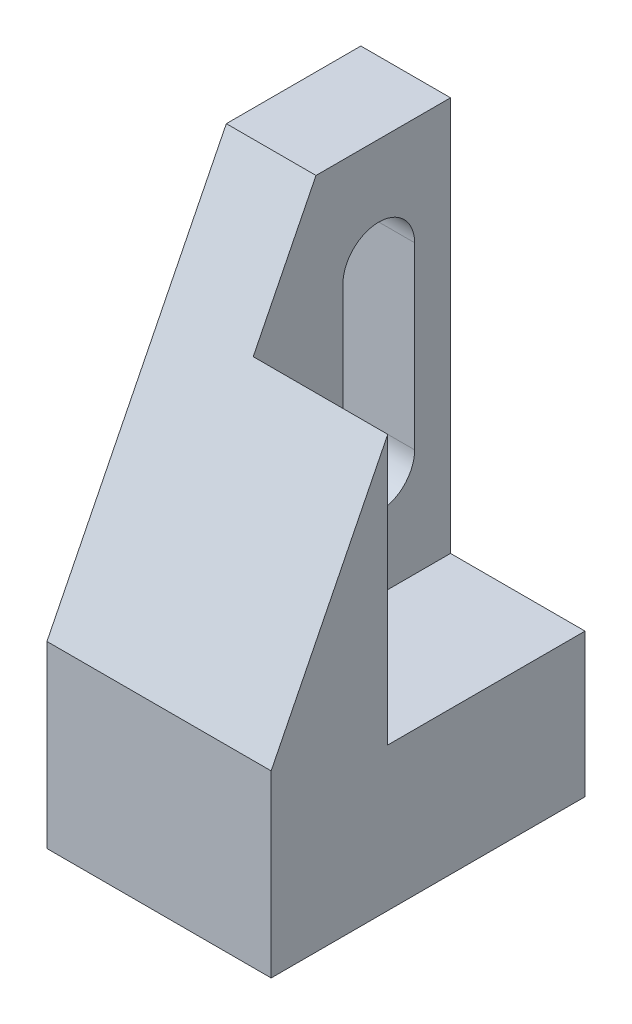
ISO-10303-21;
HEADER;
FILE_DESCRIPTION(('STEP AP214'),'2;1');
FILE_NAME('part.step','',(''),(''),'','','');
FILE_SCHEMA(('AUTOMOTIVE_DESIGN { 1 0 10303 214 1 1 1 1 }'));
ENDSEC;
DATA;
#1=APPLICATION_CONTEXT('core data for automotive mechanical design processes');
#2=APPLICATION_PROTOCOL_DEFINITION('international standard','automotive_design',2000,#1);
#3=PRODUCT_CONTEXT('',#1,'mechanical');
#4=PRODUCT('Part','Part','',(#3));
#5=PRODUCT_RELATED_PRODUCT_CATEGORY('part','',(#4));
#6=PRODUCT_DEFINITION_FORMATION('','',#4);
#7=PRODUCT_DEFINITION_CONTEXT('part definition',#1,'design');
#8=PRODUCT_DEFINITION('design','',#6,#7);
#9=PRODUCT_DEFINITION_SHAPE('','',#8);
#10=(LENGTH_UNIT() NAMED_UNIT(*) SI_UNIT(.MILLI.,.METRE.));
#11=(NAMED_UNIT(*) PLANE_ANGLE_UNIT() SI_UNIT($,.RADIAN.));
#12=(NAMED_UNIT(*) SI_UNIT($,.STERADIAN.) SOLID_ANGLE_UNIT());
#13=UNCERTAINTY_MEASURE_WITH_UNIT(LENGTH_MEASURE(1.E-05),#10,'distance_accuracy_value','');
#14=(GEOMETRIC_REPRESENTATION_CONTEXT(3) GLOBAL_UNCERTAINTY_ASSIGNED_CONTEXT((#13)) GLOBAL_UNIT_ASSIGNED_CONTEXT((#10,
#11,#12)) REPRESENTATION_CONTEXT('',''));
#15=CARTESIAN_POINT('',(0.,0.,0.));
#16=DIRECTION('',(0.,0.,1.));
#17=DIRECTION('',(1.,0.,0.));
#18=AXIS2_PLACEMENT_3D('',#15,#16,#17);
#19=CARTESIAN_POINT('',(25.,7.2,14.4));
#20=DIRECTION('',(0.,-0.447213595499958,-0.894427190999916));
#21=DIRECTION('',(0.,0.894427190999916,-0.447213595499958));
#22=AXIS2_PLACEMENT_3D('',#19,#20,#21);
#23=PLANE('',#22);
#24=DIRECTION('',(1.,0.,0.));
#25=VECTOR('',#24,1.);
#26=CARTESIAN_POINT('',(10.,8.,14.));
#27=LINE('',#26,#25);
#28=CARTESIAN_POINT('',(10.,8.,14.));
#29=VERTEX_POINT('',#28);
#30=CARTESIAN_POINT('',(25.,8.,14.));
#31=VERTEX_POINT('',#30);
#32=EDGE_CURVE('E234',#29,#31,#27,.T.);
#33=ORIENTED_EDGE('',*,*,#32,.F.);
#34=DIRECTION('',(0.,-0.894427190999916,0.447213595499958));
#35=VECTOR('',#34,1.);
#36=CARTESIAN_POINT('',(10.,7.2,14.4));
#37=LINE('',#36,#35);
#38=CARTESIAN_POINT('',(10.,22.,7.));
#39=VERTEX_POINT('',#38);
#40=EDGE_CURVE('E237',#39,#29,#37,.T.);
#41=ORIENTED_EDGE('',*,*,#40,.F.);
#42=DIRECTION('',(-1.,0.,0.));
#43=VECTOR('',#42,1.);
#44=CARTESIAN_POINT('',(25.,22.,7.));
#45=LINE('',#44,#43);
#46=CARTESIAN_POINT('',(0.,22.,7.));
#47=VERTEX_POINT('',#46);
#48=EDGE_CURVE('E148',#39,#47,#45,.T.);
#49=ORIENTED_EDGE('',*,*,#48,.T.);
#50=DIRECTION('',(0.,-0.894427190999916,0.447213595499958));
#51=VECTOR('',#50,1.);
#52=CARTESIAN_POINT('',(0.,7.2,14.4));
#53=LINE('',#52,#51);
#54=CARTESIAN_POINT('',(0.,-18.,27.));
#55=VERTEX_POINT('',#54);
#56=EDGE_CURVE('E167',#47,#55,#53,.T.);
#57=ORIENTED_EDGE('',*,*,#56,.T.);
#58=DIRECTION('',(-1.,0.,0.));
#59=VECTOR('',#58,1.);
#60=CARTESIAN_POINT('',(25.,-18.,27.));
#61=LINE('',#60,#59);
#62=CARTESIAN_POINT('',(25.,-18.,27.));
#63=VERTEX_POINT('',#62);
#64=EDGE_CURVE('E11',#63,#55,#61,.T.);
#65=ORIENTED_EDGE('',*,*,#64,.F.);
#66=DIRECTION('',(0.,-0.894427190999916,0.447213595499958));
#67=VECTOR('',#66,1.);
#68=CARTESIAN_POINT('',(25.,7.2,14.4));
#69=LINE('',#68,#67);
#70=EDGE_CURVE('E156',#31,#63,#69,.T.);
#71=ORIENTED_EDGE('',*,*,#70,.F.);
#72=EDGE_LOOP('',(#33,#41,#49,#57,#65,#71));
#73=FACE_BOUND('',#72,.T.);
#74=ADVANCED_FACE('F39',(#73),#23,.F.);
#75=CARTESIAN_POINT('',(25.,0.,-8.));
#76=DIRECTION('',(0.,0.,1.));
#77=DIRECTION('',(1.,0.,0.));
#78=AXIS2_PLACEMENT_3D('',#75,#76,#77);
#79=PLANE('',#78);
#80=DIRECTION('',(1.,0.,0.));
#81=VECTOR('',#80,1.);
#82=CARTESIAN_POINT('',(10.,-22.,-8.));
#83=LINE('',#82,#81);
#84=CARTESIAN_POINT('',(10.,-22.,-8.));
#85=VERTEX_POINT('',#84);
#86=CARTESIAN_POINT('',(25.,-22.,-8.));
#87=VERTEX_POINT('',#86);
#88=EDGE_CURVE('E199',#85,#87,#83,.T.);
#89=ORIENTED_EDGE('',*,*,#88,.T.);
#90=DIRECTION('',(0.,1.,0.));
#91=VECTOR('',#90,1.);
#92=CARTESIAN_POINT('',(25.,0.,-8.));
#93=LINE('',#92,#91);
#94=CARTESIAN_POINT('',(25.,-38.,-8.));
#95=VERTEX_POINT('',#94);
#96=EDGE_CURVE('E163',#95,#87,#93,.T.);
#97=ORIENTED_EDGE('',*,*,#96,.F.);
#98=DIRECTION('',(-1.,0.,0.));
#99=VECTOR('',#98,1.);
#100=CARTESIAN_POINT('',(25.,-38.,-8.));
#101=LINE('',#100,#99);
#102=CARTESIAN_POINT('',(0.,-38.,-8.));
#103=VERTEX_POINT('',#102);
#104=EDGE_CURVE('E166',#95,#103,#101,.T.);
#105=ORIENTED_EDGE('',*,*,#104,.T.);
#106=DIRECTION('',(0.,1.,0.));
#107=VECTOR('',#106,1.);
#108=CARTESIAN_POINT('',(0.,0.,-8.));
#109=LINE('',#108,#107);
#110=CARTESIAN_POINT('',(0.,22.,-8.));
#111=VERTEX_POINT('',#110);
#112=EDGE_CURVE('E159',#103,#111,#109,.T.);
#113=ORIENTED_EDGE('',*,*,#112,.T.);
#114=DIRECTION('',(-1.,0.,0.));
#115=VECTOR('',#114,1.);
#116=CARTESIAN_POINT('',(25.,22.,-8.));
#117=LINE('',#116,#115);
#118=CARTESIAN_POINT('',(10.,22.,-8.));
#119=VERTEX_POINT('',#118);
#120=EDGE_CURVE('E150',#119,#111,#117,.T.);
#121=ORIENTED_EDGE('',*,*,#120,.F.);
#122=DIRECTION('',(0.,1.,0.));
#123=VECTOR('',#122,1.);
#124=CARTESIAN_POINT('',(10.,0.,-8.));
#125=LINE('',#124,#123);
#126=EDGE_CURVE('E53',#85,#119,#125,.T.);
#127=ORIENTED_EDGE('',*,*,#126,.F.);
#128=EDGE_LOOP('',(#89,#97,#105,#113,#121,#127));
#129=FACE_BOUND('',#128,.T.);
#130=ADVANCED_FACE('F197',(#129),#79,.F.);
#131=CARTESIAN_POINT('',(25.,0.,0.));
#132=DIRECTION('',(1.,0.,0.));
#133=DIRECTION('',(0.,0.,-1.));
#134=AXIS2_PLACEMENT_3D('',#131,#132,#133);
#135=PLANE('',#134);
#136=DIRECTION('',(0.,0.,1.));
#137=VECTOR('',#136,1.);
#138=CARTESIAN_POINT('',(25.,-22.,0.));
#139=LINE('',#138,#137);
#140=CARTESIAN_POINT('',(25.,-22.,14.));
#141=VERTEX_POINT('',#140);
#142=EDGE_CURVE('E134',#87,#141,#139,.T.);
#143=ORIENTED_EDGE('',*,*,#142,.T.);
#144=DIRECTION('',(0.,1.,0.));
#145=VECTOR('',#144,1.);
#146=CARTESIAN_POINT('',(25.,0.,14.));
#147=LINE('',#146,#145);
#148=EDGE_CURVE('E241',#141,#31,#147,.T.);
#149=ORIENTED_EDGE('',*,*,#148,.T.);
#150=ORIENTED_EDGE('',*,*,#70,.T.);
#151=DIRECTION('',(0.,-1.,0.));
#152=VECTOR('',#151,1.);
#153=CARTESIAN_POINT('',(25.,0.,27.));
#154=LINE('',#153,#152);
#155=CARTESIAN_POINT('',(25.,-38.,27.));
#156=VERTEX_POINT('',#155);
#157=EDGE_CURVE('E158',#63,#156,#154,.T.);
#158=ORIENTED_EDGE('',*,*,#157,.T.);
#159=DIRECTION('',(0.,0.,-1.));
#160=VECTOR('',#159,1.);
#161=CARTESIAN_POINT('',(25.,-38.,0.));
#162=LINE('',#161,#160);
#163=EDGE_CURVE('E161',#156,#95,#162,.T.);
#164=ORIENTED_EDGE('',*,*,#163,.T.);
#165=ORIENTED_EDGE('',*,*,#96,.T.);
#166=EDGE_LOOP('',(#143,#149,#150,#158,#164,#165));
#167=FACE_BOUND('',#166,.T.);
#168=ADVANCED_FACE('F202',(#167),#135,.T.);
#169=CARTESIAN_POINT('',(25.,22.,0.));
#170=DIRECTION('',(0.,-1.,0.));
#171=DIRECTION('',(0.,0.,-1.));
#172=AXIS2_PLACEMENT_3D('',#169,#170,#171);
#173=PLANE('',#172);
#174=DIRECTION('',(0.,0.,1.));
#175=VECTOR('',#174,1.);
#176=CARTESIAN_POINT('',(10.,22.,0.));
#177=LINE('',#176,#175);
#178=EDGE_CURVE('E245',#119,#39,#177,.T.);
#179=ORIENTED_EDGE('',*,*,#178,.F.);
#180=ORIENTED_EDGE('',*,*,#120,.T.);
#181=DIRECTION('',(0.,0.,1.));
#182=VECTOR('',#181,1.);
#183=CARTESIAN_POINT('',(0.,22.,0.));
#184=LINE('',#183,#182);
#185=EDGE_CURVE('E193',#111,#47,#184,.T.);
#186=ORIENTED_EDGE('',*,*,#185,.T.);
#187=ORIENTED_EDGE('',*,*,#48,.F.);
#188=EDGE_LOOP('',(#179,#180,#186,#187));
#189=FACE_BOUND('',#188,.T.);
#190=ADVANCED_FACE('F212',(#189),#173,.F.);
#191=CARTESIAN_POINT('',(25.,10.,0.));
#192=DIRECTION('',(-1.,0.,0.));
#193=DIRECTION('',(0.,0.,1.));
#194=AXIS2_PLACEMENT_3D('',#191,#192,#193);
#195=CYLINDRICAL_SURFACE('',#194,4.);
#196=DIRECTION('',(-1.,0.,0.));
#197=VECTOR('',#196,1.);
#198=CARTESIAN_POINT('',(25.,10.,-4.));
#199=LINE('',#198,#197);
#200=CARTESIAN_POINT('',(10.,10.,-4.));
#201=VERTEX_POINT('',#200);
#202=CARTESIAN_POINT('',(0.,10.,-4.));
#203=VERTEX_POINT('',#202);
#204=EDGE_CURVE('E140',#201,#203,#199,.T.);
#205=ORIENTED_EDGE('',*,*,#204,.F.);
#206=CARTESIAN_POINT('',(10.,10.,0.));
#207=DIRECTION('',(1.,0.,0.));
#208=DIRECTION('',(0.,0.,-1.));
#209=AXIS2_PLACEMENT_3D('',#206,#207,#208);
#210=CIRCLE('',#209,4.);
#211=CARTESIAN_POINT('',(10.,10.,4.));
#212=VERTEX_POINT('',#211);
#213=EDGE_CURVE('E126',#201,#212,#210,.T.);
#214=ORIENTED_EDGE('',*,*,#213,.T.);
#215=DIRECTION('',(-1.,0.,0.));
#216=VECTOR('',#215,1.);
#217=CARTESIAN_POINT('',(25.,10.,4.));
#218=LINE('',#217,#216);
#219=CARTESIAN_POINT('',(0.,10.,4.));
#220=VERTEX_POINT('',#219);
#221=EDGE_CURVE('E213',#212,#220,#218,.T.);
#222=ORIENTED_EDGE('',*,*,#221,.T.);
#223=CARTESIAN_POINT('',(0.,10.,0.));
#224=DIRECTION('',(1.,0.,0.));
#225=DIRECTION('',(0.,0.,-1.));
#226=AXIS2_PLACEMENT_3D('',#223,#224,#225);
#227=CIRCLE('',#226,4.);
#228=EDGE_CURVE('E146',#203,#220,#227,.T.);
#229=ORIENTED_EDGE('',*,*,#228,.F.);
#230=EDGE_LOOP('',(#205,#214,#222,#229));
#231=FACE_BOUND('',#230,.T.);
#232=ADVANCED_FACE('F144',(#231),#195,.F.);
#233=CARTESIAN_POINT('',(25.,0.,-4.));
#234=DIRECTION('',(0.,0.,1.));
#235=DIRECTION('',(1.,0.,0.));
#236=AXIS2_PLACEMENT_3D('',#233,#234,#235);
#237=PLANE('',#236);
#238=DIRECTION('',(-1.,0.,0.));
#239=VECTOR('',#238,1.);
#240=CARTESIAN_POINT('',(25.,-10.,-4.));
#241=LINE('',#240,#239);
#242=CARTESIAN_POINT('',(10.,-10.,-4.));
#243=VERTEX_POINT('',#242);
#244=CARTESIAN_POINT('',(0.,-10.,-4.));
#245=VERTEX_POINT('',#244);
#246=EDGE_CURVE('E142',#243,#245,#241,.T.);
#247=ORIENTED_EDGE('',*,*,#246,.F.);
#248=DIRECTION('',(0.,1.,0.));
#249=VECTOR('',#248,1.);
#250=CARTESIAN_POINT('',(10.,0.,-4.));
#251=LINE('',#250,#249);
#252=EDGE_CURVE('E129',#243,#201,#251,.T.);
#253=ORIENTED_EDGE('',*,*,#252,.T.);
#254=ORIENTED_EDGE('',*,*,#204,.T.);
#255=DIRECTION('',(0.,1.,0.));
#256=VECTOR('',#255,1.);
#257=CARTESIAN_POINT('',(0.,0.,-4.));
#258=LINE('',#257,#256);
#259=EDGE_CURVE('E230',#245,#203,#258,.T.);
#260=ORIENTED_EDGE('',*,*,#259,.F.);
#261=EDGE_LOOP('',(#247,#253,#254,#260));
#262=FACE_BOUND('',#261,.T.);
#263=ADVANCED_FACE('F138',(#262),#237,.T.);
#264=CARTESIAN_POINT('',(25.,-10.,0.));
#265=DIRECTION('',(-1.,0.,0.));
#266=DIRECTION('',(0.,0.,1.));
#267=AXIS2_PLACEMENT_3D('',#264,#265,#266);
#268=CYLINDRICAL_SURFACE('',#267,4.);
#269=DIRECTION('',(-1.,0.,0.));
#270=VECTOR('',#269,1.);
#271=CARTESIAN_POINT('',(25.,-10.,4.));
#272=LINE('',#271,#270);
#273=CARTESIAN_POINT('',(10.,-10.,4.));
#274=VERTEX_POINT('',#273);
#275=CARTESIAN_POINT('',(0.,-10.,4.));
#276=VERTEX_POINT('',#275);
#277=EDGE_CURVE('E152',#274,#276,#272,.T.);
#278=ORIENTED_EDGE('',*,*,#277,.F.);
#279=CARTESIAN_POINT('',(10.,-10.,0.));
#280=DIRECTION('',(1.,0.,0.));
#281=DIRECTION('',(0.,0.,-1.));
#282=AXIS2_PLACEMENT_3D('',#279,#280,#281);
#283=CIRCLE('',#282,4.);
#284=EDGE_CURVE('E61',#274,#243,#283,.T.);
#285=ORIENTED_EDGE('',*,*,#284,.T.);
#286=ORIENTED_EDGE('',*,*,#246,.T.);
#287=CARTESIAN_POINT('',(0.,-10.,0.));
#288=DIRECTION('',(1.,0.,0.));
#289=DIRECTION('',(0.,0.,-1.));
#290=AXIS2_PLACEMENT_3D('',#287,#288,#289);
#291=CIRCLE('',#290,4.);
#292=EDGE_CURVE('E218',#276,#245,#291,.T.);
#293=ORIENTED_EDGE('',*,*,#292,.F.);
#294=EDGE_LOOP('',(#278,#285,#286,#293));
#295=FACE_BOUND('',#294,.T.);
#296=ADVANCED_FACE('F229',(#295),#268,.F.);
#297=CARTESIAN_POINT('',(25.,0.,4.));
#298=DIRECTION('',(0.,0.,1.));
#299=DIRECTION('',(1.,0.,0.));
#300=AXIS2_PLACEMENT_3D('',#297,#298,#299);
#301=PLANE('',#300);
#302=DIRECTION('',(0.,1.,0.));
#303=VECTOR('',#302,1.);
#304=CARTESIAN_POINT('',(10.,0.,4.));
#305=LINE('',#304,#303);
#306=EDGE_CURVE('E130',#274,#212,#305,.T.);
#307=ORIENTED_EDGE('',*,*,#306,.F.);
#308=ORIENTED_EDGE('',*,*,#277,.T.);
#309=DIRECTION('',(0.,1.,0.));
#310=VECTOR('',#309,1.);
#311=CARTESIAN_POINT('',(0.,0.,4.));
#312=LINE('',#311,#310);
#313=EDGE_CURVE('E214',#276,#220,#312,.T.);
#314=ORIENTED_EDGE('',*,*,#313,.T.);
#315=ORIENTED_EDGE('',*,*,#221,.F.);
#316=EDGE_LOOP('',(#307,#308,#314,#315));
#317=FACE_BOUND('',#316,.T.);
#318=ADVANCED_FACE('F225',(#317),#301,.F.);
#319=CARTESIAN_POINT('',(25.,0.,27.));
#320=DIRECTION('',(0.,0.,-1.));
#321=DIRECTION('',(-1.,0.,0.));
#322=AXIS2_PLACEMENT_3D('',#319,#320,#321);
#323=PLANE('',#322);
#324=DIRECTION('',(0.,-1.,0.));
#325=VECTOR('',#324,1.);
#326=CARTESIAN_POINT('',(0.,0.,27.));
#327=LINE('',#326,#325);
#328=CARTESIAN_POINT('',(0.,-38.,27.));
#329=VERTEX_POINT('',#328);
#330=EDGE_CURVE('E169',#55,#329,#327,.T.);
#331=ORIENTED_EDGE('',*,*,#330,.T.);
#332=DIRECTION('',(-1.,0.,0.));
#333=VECTOR('',#332,1.);
#334=CARTESIAN_POINT('',(25.,-38.,27.));
#335=LINE('',#334,#333);
#336=EDGE_CURVE('E46',#156,#329,#335,.T.);
#337=ORIENTED_EDGE('',*,*,#336,.F.);
#338=ORIENTED_EDGE('',*,*,#157,.F.);
#339=ORIENTED_EDGE('',*,*,#64,.T.);
#340=EDGE_LOOP('',(#331,#337,#338,#339));
#341=FACE_BOUND('',#340,.T.);
#342=ADVANCED_FACE('F206',(#341),#323,.F.);
#343=CARTESIAN_POINT('',(25.,-38.,0.));
#344=DIRECTION('',(0.,1.,0.));
#345=DIRECTION('',(0.,0.,1.));
#346=AXIS2_PLACEMENT_3D('',#343,#344,#345);
#347=PLANE('',#346);
#348=DIRECTION('',(0.,0.,-1.));
#349=VECTOR('',#348,1.);
#350=CARTESIAN_POINT('',(0.,-38.,0.));
#351=LINE('',#350,#349);
#352=EDGE_CURVE('E171',#329,#103,#351,.T.);
#353=ORIENTED_EDGE('',*,*,#352,.T.);
#354=ORIENTED_EDGE('',*,*,#104,.F.);
#355=ORIENTED_EDGE('',*,*,#163,.F.);
#356=ORIENTED_EDGE('',*,*,#336,.T.);
#357=EDGE_LOOP('',(#353,#354,#355,#356));
#358=FACE_BOUND('',#357,.T.);
#359=ADVANCED_FACE('F181',(#358),#347,.F.);
#360=CARTESIAN_POINT('',(0.,0.,0.));
#361=DIRECTION('',(1.,0.,0.));
#362=DIRECTION('',(0.,0.,-1.));
#363=AXIS2_PLACEMENT_3D('',#360,#361,#362);
#364=PLANE('',#363);
#365=ORIENTED_EDGE('',*,*,#56,.F.);
#366=ORIENTED_EDGE('',*,*,#185,.F.);
#367=ORIENTED_EDGE('',*,*,#112,.F.);
#368=ORIENTED_EDGE('',*,*,#352,.F.);
#369=ORIENTED_EDGE('',*,*,#330,.F.);
#370=EDGE_LOOP('',(#365,#366,#367,#368,#369));
#371=FACE_BOUND('',#370,.T.);
#372=ORIENTED_EDGE('',*,*,#228,.T.);
#373=ORIENTED_EDGE('',*,*,#313,.F.);
#374=ORIENTED_EDGE('',*,*,#292,.T.);
#375=ORIENTED_EDGE('',*,*,#259,.T.);
#376=EDGE_LOOP('',(#372,#373,#374,#375));
#377=FACE_BOUND('',#376,.T.);
#378=ADVANCED_FACE('F189',(#371,#377),#364,.F.);
#379=CARTESIAN_POINT('',(10.,0.,14.));
#380=DIRECTION('',(0.,0.,-1.));
#381=DIRECTION('',(-1.,0.,0.));
#382=AXIS2_PLACEMENT_3D('',#379,#380,#381);
#383=PLANE('',#382);
#384=ORIENTED_EDGE('',*,*,#148,.F.);
#385=DIRECTION('',(1.,0.,0.));
#386=VECTOR('',#385,1.);
#387=CARTESIAN_POINT('',(10.,-22.,14.));
#388=LINE('',#387,#386);
#389=CARTESIAN_POINT('',(10.,-22.,14.));
#390=VERTEX_POINT('',#389);
#391=EDGE_CURVE('E235',#390,#141,#388,.T.);
#392=ORIENTED_EDGE('',*,*,#391,.F.);
#393=DIRECTION('',(0.,1.,0.));
#394=VECTOR('',#393,1.);
#395=CARTESIAN_POINT('',(10.,0.,14.));
#396=LINE('',#395,#394);
#397=EDGE_CURVE('E250',#390,#29,#396,.T.);
#398=ORIENTED_EDGE('',*,*,#397,.T.);
#399=ORIENTED_EDGE('',*,*,#32,.T.);
#400=EDGE_LOOP('',(#384,#392,#398,#399));
#401=FACE_BOUND('',#400,.T.);
#402=ADVANCED_FACE('F257',(#401),#383,.T.);
#403=CARTESIAN_POINT('',(10.,-22.,0.));
#404=DIRECTION('',(0.,1.,0.));
#405=DIRECTION('',(0.,0.,1.));
#406=AXIS2_PLACEMENT_3D('',#403,#404,#405);
#407=PLANE('',#406);
#408=ORIENTED_EDGE('',*,*,#142,.F.);
#409=ORIENTED_EDGE('',*,*,#88,.F.);
#410=DIRECTION('',(0.,0.,1.));
#411=VECTOR('',#410,1.);
#412=CARTESIAN_POINT('',(10.,-22.,0.));
#413=LINE('',#412,#411);
#414=EDGE_CURVE('E248',#85,#390,#413,.T.);
#415=ORIENTED_EDGE('',*,*,#414,.T.);
#416=ORIENTED_EDGE('',*,*,#391,.T.);
#417=EDGE_LOOP('',(#408,#409,#415,#416));
#418=FACE_BOUND('',#417,.T.);
#419=ADVANCED_FACE('F259',(#418),#407,.T.);
#420=CARTESIAN_POINT('',(10.,0.,0.));
#421=DIRECTION('',(1.,0.,0.));
#422=DIRECTION('',(0.,0.,-1.));
#423=AXIS2_PLACEMENT_3D('',#420,#421,#422);
#424=PLANE('',#423);
#425=ORIENTED_EDGE('',*,*,#213,.F.);
#426=ORIENTED_EDGE('',*,*,#252,.F.);
#427=ORIENTED_EDGE('',*,*,#284,.F.);
#428=ORIENTED_EDGE('',*,*,#306,.T.);
#429=EDGE_LOOP('',(#425,#426,#427,#428));
#430=FACE_BOUND('',#429,.T.);
#431=ORIENTED_EDGE('',*,*,#397,.F.);
#432=ORIENTED_EDGE('',*,*,#414,.F.);
#433=ORIENTED_EDGE('',*,*,#126,.T.);
#434=ORIENTED_EDGE('',*,*,#178,.T.);
#435=ORIENTED_EDGE('',*,*,#40,.T.);
#436=EDGE_LOOP('',(#431,#432,#433,#434,#435));
#437=FACE_BOUND('',#436,.T.);
#438=ADVANCED_FACE('F128',(#430,#437),#424,.T.);
#439=CLOSED_SHELL('',(#74,#130,#168,#190,#232,#263,#296,#318,#342,#359,#378,#402,#419,#438));
#440=MANIFOLD_SOLID_BREP('B2',#439);
#441=ADVANCED_BREP_SHAPE_REPRESENTATION('',(#18,#440),#14);
#442=SHAPE_DEFINITION_REPRESENTATION(#9,#441);
ENDSEC;
END-ISO-10303-21;
